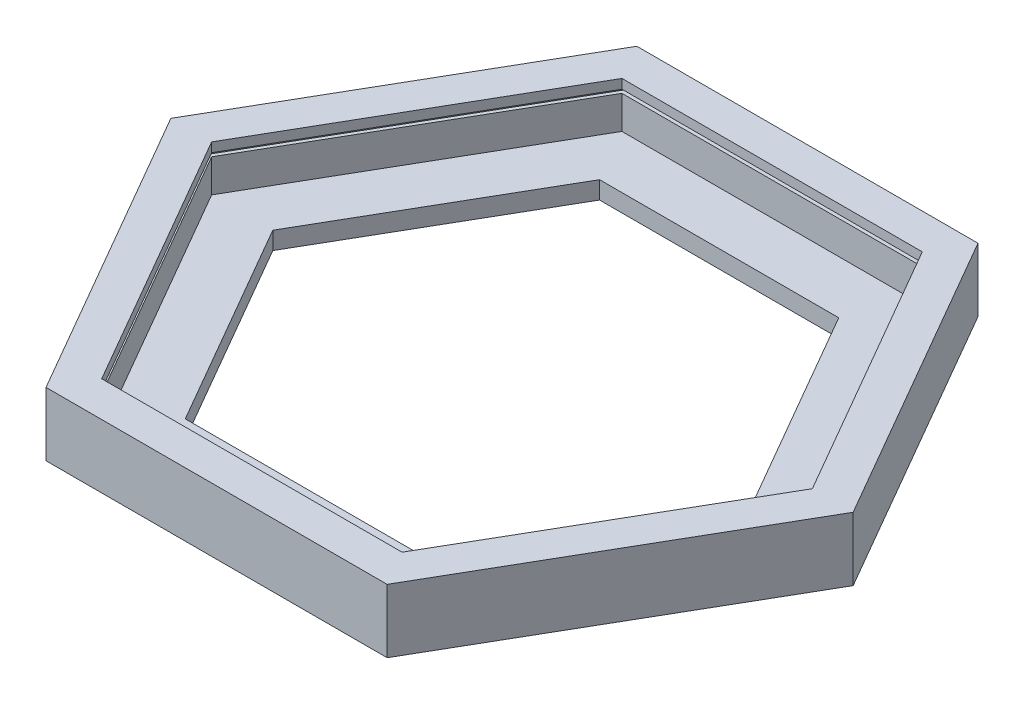
ISO-10303-21;
HEADER;
FILE_DESCRIPTION(('STEP AP214'),'2;1');
FILE_NAME('part.step','',(''),(''),'','','');
FILE_SCHEMA(('AUTOMOTIVE_DESIGN { 1 0 10303 214 1 1 1 1 }'));
ENDSEC;
DATA;
#1=APPLICATION_CONTEXT('core data for automotive mechanical design processes');
#2=APPLICATION_PROTOCOL_DEFINITION('international standard','automotive_design',2000,#1);
#3=PRODUCT_CONTEXT('',#1,'mechanical');
#4=PRODUCT('Part','Part','',(#3));
#5=PRODUCT_RELATED_PRODUCT_CATEGORY('part','',(#4));
#6=PRODUCT_DEFINITION_FORMATION('','',#4);
#7=PRODUCT_DEFINITION_CONTEXT('part definition',#1,'design');
#8=PRODUCT_DEFINITION('design','',#6,#7);
#9=PRODUCT_DEFINITION_SHAPE('','',#8);
#10=(LENGTH_UNIT() NAMED_UNIT(*) SI_UNIT(.MILLI.,.METRE.));
#11=(NAMED_UNIT(*) PLANE_ANGLE_UNIT() SI_UNIT($,.RADIAN.));
#12=(NAMED_UNIT(*) SI_UNIT($,.STERADIAN.) SOLID_ANGLE_UNIT());
#13=UNCERTAINTY_MEASURE_WITH_UNIT(LENGTH_MEASURE(1.E-05),#10,'distance_accuracy_value','');
#14=(GEOMETRIC_REPRESENTATION_CONTEXT(3) GLOBAL_UNCERTAINTY_ASSIGNED_CONTEXT((#13)) GLOBAL_UNIT_ASSIGNED_CONTEXT((#10,
#11,#12)) REPRESENTATION_CONTEXT('',''));
#15=CARTESIAN_POINT('',(0.,0.,0.));
#16=DIRECTION('',(0.,0.,1.));
#17=DIRECTION('',(1.,0.,0.));
#18=AXIS2_PLACEMENT_3D('',#15,#16,#17);
#19=CARTESIAN_POINT('',(-63.789419175,18.,36.8288383321362));
#20=DIRECTION('',(0.866025403784438,0.,-0.500000000000001));
#21=DIRECTION('',(-0.500000000000001,0.,-0.866025403784438));
#22=AXIS2_PLACEMENT_3D('',#19,#20,#21);
#23=PLANE('',#22);
#24=DIRECTION('',(0.,-1.,0.));
#25=VECTOR('',#24,1.);
#26=CARTESIAN_POINT('',(-85.0525589,18.,0.));
#27=LINE('',#26,#25);
#28=CARTESIAN_POINT('',(-85.0525589,14.35,0.));
#29=VERTEX_POINT('',#28);
#30=CARTESIAN_POINT('',(-85.0525589,5.,0.));
#31=VERTEX_POINT('',#30);
#32=EDGE_CURVE('E274',#29,#31,#27,.T.);
#33=ORIENTED_EDGE('',*,*,#32,.F.);
#34=DIRECTION('',(0.5,0.,0.866025403784439));
#35=VECTOR('',#34,1.);
#36=CARTESIAN_POINT('',(-85.0525589,14.35,0.));
#37=LINE('',#36,#35);
#38=CARTESIAN_POINT('',(-42.52627945,14.35,73.6576766642723));
#39=VERTEX_POINT('',#38);
#40=EDGE_CURVE('E481',#29,#39,#37,.T.);
#41=ORIENTED_EDGE('',*,*,#40,.T.);
#42=DIRECTION('',(0.,-1.,0.));
#43=VECTOR('',#42,1.);
#44=CARTESIAN_POINT('',(-42.5262794499999,18.,73.6576766642723));
#45=LINE('',#44,#43);
#46=CARTESIAN_POINT('',(-42.5262794499999,5.,73.6576766642723));
#47=VERTEX_POINT('',#46);
#48=EDGE_CURVE('E476',#39,#47,#45,.T.);
#49=ORIENTED_EDGE('',*,*,#48,.T.);
#50=DIRECTION('',(-0.500000000000001,0.,-0.866025403784438));
#51=VECTOR('',#50,1.);
#52=CARTESIAN_POINT('',(-63.789419175,5.,36.8288383321362));
#53=LINE('',#52,#51);
#54=EDGE_CURVE('E293',#47,#31,#53,.T.);
#55=ORIENTED_EDGE('',*,*,#54,.T.);
#56=EDGE_LOOP('',(#33,#41,#49,#55));
#57=FACE_BOUND('',#56,.T.);
#58=ADVANCED_FACE('F41',(#57),#23,.T.);
#59=CARTESIAN_POINT('',(-63.789419175,18.,-36.8288383321361));
#60=DIRECTION('',(0.866025403784439,0.,0.5));
#61=DIRECTION('',(0.5,0.,-0.866025403784439));
#62=AXIS2_PLACEMENT_3D('',#59,#60,#61);
#63=PLANE('',#62);
#64=DIRECTION('',(0.,-1.,0.));
#65=VECTOR('',#64,1.);
#66=CARTESIAN_POINT('',(-42.52627945,18.,-73.6576766642723));
#67=LINE('',#66,#65);
#68=CARTESIAN_POINT('',(-42.52627945,14.35,-73.6576766642723));
#69=VERTEX_POINT('',#68);
#70=CARTESIAN_POINT('',(-42.52627945,5.,-73.6576766642723));
#71=VERTEX_POINT('',#70);
#72=EDGE_CURVE('E270',#69,#71,#67,.T.);
#73=ORIENTED_EDGE('',*,*,#72,.F.);
#74=DIRECTION('',(-0.5,0.,0.866025403784439));
#75=VECTOR('',#74,1.);
#76=CARTESIAN_POINT('',(-42.52627945,14.35,-73.6576766642723));
#77=LINE('',#76,#75);
#78=EDGE_CURVE('E504',#69,#29,#77,.T.);
#79=ORIENTED_EDGE('',*,*,#78,.T.);
#80=ORIENTED_EDGE('',*,*,#32,.T.);
#81=DIRECTION('',(0.5,0.,-0.866025403784439));
#82=VECTOR('',#81,1.);
#83=CARTESIAN_POINT('',(-63.789419175,5.,-36.8288383321361));
#84=LINE('',#83,#82);
#85=EDGE_CURVE('E290',#31,#71,#84,.T.);
#86=ORIENTED_EDGE('',*,*,#85,.T.);
#87=EDGE_LOOP('',(#73,#79,#80,#86));
#88=FACE_BOUND('',#87,.T.);
#89=ADVANCED_FACE('F408',(#88),#63,.T.);
#90=CARTESIAN_POINT('',(0.,18.,-73.6576766642723));
#91=DIRECTION('',(0.,0.,1.));
#92=DIRECTION('',(1.,0.,0.));
#93=AXIS2_PLACEMENT_3D('',#90,#91,#92);
#94=PLANE('',#93);
#95=DIRECTION('',(0.,-1.,0.));
#96=VECTOR('',#95,1.);
#97=CARTESIAN_POINT('',(42.52627945,18.,-73.6576766642723));
#98=LINE('',#97,#96);
#99=CARTESIAN_POINT('',(42.52627945,14.35,-73.6576766642723));
#100=VERTEX_POINT('',#99);
#101=CARTESIAN_POINT('',(42.52627945,5.,-73.6576766642723));
#102=VERTEX_POINT('',#101);
#103=EDGE_CURVE('E262',#100,#102,#98,.T.);
#104=ORIENTED_EDGE('',*,*,#103,.F.);
#105=DIRECTION('',(-1.,0.,0.));
#106=VECTOR('',#105,1.);
#107=CARTESIAN_POINT('',(42.52627945,14.35,-73.6576766642723));
#108=LINE('',#107,#106);
#109=EDGE_CURVE('E501',#100,#69,#108,.T.);
#110=ORIENTED_EDGE('',*,*,#109,.T.);
#111=ORIENTED_EDGE('',*,*,#72,.T.);
#112=DIRECTION('',(1.,0.,0.));
#113=VECTOR('',#112,1.);
#114=CARTESIAN_POINT('',(0.,5.,-73.6576766642723));
#115=LINE('',#114,#113);
#116=EDGE_CURVE('E287',#71,#102,#115,.T.);
#117=ORIENTED_EDGE('',*,*,#116,.T.);
#118=EDGE_LOOP('',(#104,#110,#111,#117));
#119=FACE_BOUND('',#118,.T.);
#120=ADVANCED_FACE('F416',(#119),#94,.T.);
#121=CARTESIAN_POINT('',(63.789419175,18.,-36.8288383321362));
#122=DIRECTION('',(-0.866025403784438,0.,0.5));
#123=DIRECTION('',(0.5,0.,0.866025403784438));
#124=AXIS2_PLACEMENT_3D('',#121,#122,#123);
#125=PLANE('',#124);
#126=DIRECTION('',(0.,-1.,0.));
#127=VECTOR('',#126,1.);
#128=CARTESIAN_POINT('',(85.0525589,18.,0.));
#129=LINE('',#128,#127);
#130=CARTESIAN_POINT('',(85.0525589,14.35,0.));
#131=VERTEX_POINT('',#130);
#132=CARTESIAN_POINT('',(85.0525589,5.,0.));
#133=VERTEX_POINT('',#132);
#134=EDGE_CURVE('E263',#131,#133,#129,.T.);
#135=ORIENTED_EDGE('',*,*,#134,.F.);
#136=DIRECTION('',(-0.5,0.,-0.866025403784439));
#137=VECTOR('',#136,1.);
#138=CARTESIAN_POINT('',(85.0525589,14.35,0.));
#139=LINE('',#138,#137);
#140=EDGE_CURVE('E498',#131,#100,#139,.T.);
#141=ORIENTED_EDGE('',*,*,#140,.T.);
#142=ORIENTED_EDGE('',*,*,#103,.T.);
#143=DIRECTION('',(0.5,0.,0.866025403784438));
#144=VECTOR('',#143,1.);
#145=CARTESIAN_POINT('',(63.789419175,5.,-36.8288383321362));
#146=LINE('',#145,#144);
#147=EDGE_CURVE('E284',#102,#133,#146,.T.);
#148=ORIENTED_EDGE('',*,*,#147,.T.);
#149=EDGE_LOOP('',(#135,#141,#142,#148));
#150=FACE_BOUND('',#149,.T.);
#151=ADVANCED_FACE('F495',(#150),#125,.T.);
#152=CARTESIAN_POINT('',(63.789419175,18.,36.8288383321361));
#153=DIRECTION('',(-0.866025403784439,0.,-0.5));
#154=DIRECTION('',(-0.5,0.,0.866025403784439));
#155=AXIS2_PLACEMENT_3D('',#152,#153,#154);
#156=PLANE('',#155);
#157=DIRECTION('',(0.,-1.,0.));
#158=VECTOR('',#157,1.);
#159=CARTESIAN_POINT('',(42.52627945,18.,73.6576766642723));
#160=LINE('',#159,#158);
#161=CARTESIAN_POINT('',(42.52627945,14.35,73.6576766642723));
#162=VERTEX_POINT('',#161);
#163=CARTESIAN_POINT('',(42.52627945,5.,73.6576766642723));
#164=VERTEX_POINT('',#163);
#165=EDGE_CURVE('E477',#162,#164,#160,.T.);
#166=ORIENTED_EDGE('',*,*,#165,.F.);
#167=DIRECTION('',(0.5,0.,-0.866025403784439));
#168=VECTOR('',#167,1.);
#169=CARTESIAN_POINT('',(42.52627945,14.35,73.6576766642723));
#170=LINE('',#169,#168);
#171=EDGE_CURVE('E66',#162,#131,#170,.T.);
#172=ORIENTED_EDGE('',*,*,#171,.T.);
#173=ORIENTED_EDGE('',*,*,#134,.T.);
#174=DIRECTION('',(-0.5,0.,0.866025403784439));
#175=VECTOR('',#174,1.);
#176=CARTESIAN_POINT('',(63.789419175,5.,36.8288383321361));
#177=LINE('',#176,#175);
#178=EDGE_CURVE('E281',#133,#164,#177,.T.);
#179=ORIENTED_EDGE('',*,*,#178,.T.);
#180=EDGE_LOOP('',(#166,#172,#173,#179));
#181=FACE_BOUND('',#180,.T.);
#182=ADVANCED_FACE('F491',(#181),#156,.T.);
#183=CARTESIAN_POINT('',(0.,18.,73.6576766642723));
#184=DIRECTION('',(0.,0.,-1.));
#185=DIRECTION('',(-1.,0.,0.));
#186=AXIS2_PLACEMENT_3D('',#183,#184,#185);
#187=PLANE('',#186);
#188=ORIENTED_EDGE('',*,*,#48,.F.);
#189=DIRECTION('',(1.,0.,0.));
#190=VECTOR('',#189,1.);
#191=CARTESIAN_POINT('',(-42.52627945,14.35,73.6576766642723));
#192=LINE('',#191,#190);
#193=EDGE_CURVE('E247',#39,#162,#192,.T.);
#194=ORIENTED_EDGE('',*,*,#193,.T.);
#195=ORIENTED_EDGE('',*,*,#165,.T.);
#196=DIRECTION('',(-1.,0.,0.));
#197=VECTOR('',#196,1.);
#198=CARTESIAN_POINT('',(0.,5.,73.6576766642723));
#199=LINE('',#198,#197);
#200=EDGE_CURVE('E278',#164,#47,#199,.T.);
#201=ORIENTED_EDGE('',*,*,#200,.T.);
#202=EDGE_LOOP('',(#188,#194,#195,#201));
#203=FACE_BOUND('',#202,.T.);
#204=ADVANCED_FACE('F488',(#203),#187,.T.);
#205=CARTESIAN_POINT('',(-72.4496732128444,5.,-41.8288383321362));
#206=DIRECTION('',(0.866025403784439,0.,0.5));
#207=DIRECTION('',(0.5,0.,-0.866025403784439));
#208=AXIS2_PLACEMENT_3D('',#205,#206,#207);
#209=PLANE('',#208);
#210=DIRECTION('',(-0.5,0.,0.866025403784439));
#211=VECTOR('',#210,1.);
#212=CARTESIAN_POINT('',(-72.4496732128444,0.,-41.8288383321362));
#213=LINE('',#212,#211);
#214=CARTESIAN_POINT('',(-48.2997821418963,0.,-83.6576766642723));
#215=VERTEX_POINT('',#214);
#216=CARTESIAN_POINT('',(-96.5995642837926,0.,0.));
#217=VERTEX_POINT('',#216);
#218=EDGE_CURVE('E334',#215,#217,#213,.T.);
#219=ORIENTED_EDGE('',*,*,#218,.T.);
#220=DIRECTION('',(0.,-1.,0.));
#221=VECTOR('',#220,1.);
#222=CARTESIAN_POINT('',(-96.5995642837926,5.,0.));
#223=LINE('',#222,#221);
#224=CARTESIAN_POINT('',(-96.5995642837926,18.,0.));
#225=VERTEX_POINT('',#224);
#226=EDGE_CURVE('E11',#225,#217,#223,.T.);
#227=ORIENTED_EDGE('',*,*,#226,.F.);
#228=DIRECTION('',(-0.5,0.,0.866025403784439));
#229=VECTOR('',#228,1.);
#230=CARTESIAN_POINT('',(-72.4496732128444,18.,-41.8288383321362));
#231=LINE('',#230,#229);
#232=CARTESIAN_POINT('',(-48.2997821418963,18.,-83.6576766642723));
#233=VERTEX_POINT('',#232);
#234=EDGE_CURVE('E459',#233,#225,#231,.T.);
#235=ORIENTED_EDGE('',*,*,#234,.F.);
#236=DIRECTION('',(0.,-1.,0.));
#237=VECTOR('',#236,1.);
#238=CARTESIAN_POINT('',(-48.2997821418963,5.,-83.6576766642723));
#239=LINE('',#238,#237);
#240=EDGE_CURVE('E346',#233,#215,#239,.T.);
#241=ORIENTED_EDGE('',*,*,#240,.T.);
#242=EDGE_LOOP('',(#219,#227,#235,#241));
#243=FACE_BOUND('',#242,.T.);
#244=ADVANCED_FACE('F622',(#243),#209,.F.);
#245=CARTESIAN_POINT('',(-72.4496732128444,5.,41.8288383321361));
#246=DIRECTION('',(0.866025403784439,0.,-0.5));
#247=DIRECTION('',(-0.5,0.,-0.866025403784439));
#248=AXIS2_PLACEMENT_3D('',#245,#246,#247);
#249=PLANE('',#248);
#250=DIRECTION('',(0.5,0.,0.866025403784439));
#251=VECTOR('',#250,1.);
#252=CARTESIAN_POINT('',(-72.4496732128444,0.,41.8288383321361));
#253=LINE('',#252,#251);
#254=CARTESIAN_POINT('',(-48.2997821418963,0.,83.6576766642723));
#255=VERTEX_POINT('',#254);
#256=EDGE_CURVE('E337',#217,#255,#253,.T.);
#257=ORIENTED_EDGE('',*,*,#256,.T.);
#258=DIRECTION('',(0.,-1.,0.));
#259=VECTOR('',#258,1.);
#260=CARTESIAN_POINT('',(-48.2997821418963,5.,83.6576766642723));
#261=LINE('',#260,#259);
#262=CARTESIAN_POINT('',(-48.2997821418963,18.,83.6576766642723));
#263=VERTEX_POINT('',#262);
#264=EDGE_CURVE('E50',#263,#255,#261,.T.);
#265=ORIENTED_EDGE('',*,*,#264,.F.);
#266=DIRECTION('',(0.5,0.,0.866025403784439));
#267=VECTOR('',#266,1.);
#268=CARTESIAN_POINT('',(-72.4496732128444,18.,41.8288383321361));
#269=LINE('',#268,#267);
#270=EDGE_CURVE('E462',#225,#263,#269,.T.);
#271=ORIENTED_EDGE('',*,*,#270,.F.);
#272=ORIENTED_EDGE('',*,*,#226,.T.);
#273=EDGE_LOOP('',(#257,#265,#271,#272));
#274=FACE_BOUND('',#273,.T.);
#275=ADVANCED_FACE('F625',(#274),#249,.F.);
#276=CARTESIAN_POINT('',(0.,5.,83.6576766642723));
#277=DIRECTION('',(0.,0.,-1.));
#278=DIRECTION('',(-1.,0.,0.));
#279=AXIS2_PLACEMENT_3D('',#276,#277,#278);
#280=PLANE('',#279);
#281=DIRECTION('',(1.,0.,0.));
#282=VECTOR('',#281,1.);
#283=CARTESIAN_POINT('',(0.,0.,83.6576766642723));
#284=LINE('',#283,#282);
#285=CARTESIAN_POINT('',(48.2997821418963,0.,83.6576766642723));
#286=VERTEX_POINT('',#285);
#287=EDGE_CURVE('E339',#255,#286,#284,.T.);
#288=ORIENTED_EDGE('',*,*,#287,.T.);
#289=DIRECTION('',(0.,-1.,0.));
#290=VECTOR('',#289,1.);
#291=CARTESIAN_POINT('',(48.2997821418963,5.,83.6576766642723));
#292=LINE('',#291,#290);
#293=CARTESIAN_POINT('',(48.2997821418963,18.,83.6576766642723));
#294=VERTEX_POINT('',#293);
#295=EDGE_CURVE('E355',#294,#286,#292,.T.);
#296=ORIENTED_EDGE('',*,*,#295,.F.);
#297=DIRECTION('',(1.,0.,0.));
#298=VECTOR('',#297,1.);
#299=CARTESIAN_POINT('',(0.,18.,83.6576766642723));
#300=LINE('',#299,#298);
#301=EDGE_CURVE('E465',#263,#294,#300,.T.);
#302=ORIENTED_EDGE('',*,*,#301,.F.);
#303=ORIENTED_EDGE('',*,*,#264,.T.);
#304=EDGE_LOOP('',(#288,#296,#302,#303));
#305=FACE_BOUND('',#304,.T.);
#306=ADVANCED_FACE('F630',(#305),#280,.F.);
#307=CARTESIAN_POINT('',(72.4496732128444,5.,41.8288383321361));
#308=DIRECTION('',(-0.866025403784439,0.,-0.5));
#309=DIRECTION('',(-0.5,0.,0.866025403784439));
#310=AXIS2_PLACEMENT_3D('',#307,#308,#309);
#311=PLANE('',#310);
#312=DIRECTION('',(0.5,0.,-0.866025403784439));
#313=VECTOR('',#312,1.);
#314=CARTESIAN_POINT('',(72.4496732128444,0.,41.8288383321361));
#315=LINE('',#314,#313);
#316=CARTESIAN_POINT('',(96.5995642837926,0.,0.));
#317=VERTEX_POINT('',#316);
#318=EDGE_CURVE('E341',#286,#317,#315,.T.);
#319=ORIENTED_EDGE('',*,*,#318,.T.);
#320=DIRECTION('',(0.,-1.,0.));
#321=VECTOR('',#320,1.);
#322=CARTESIAN_POINT('',(96.5995642837926,5.,0.));
#323=LINE('',#322,#321);
#324=CARTESIAN_POINT('',(96.5995642837926,18.,0.));
#325=VERTEX_POINT('',#324);
#326=EDGE_CURVE('E352',#325,#317,#323,.T.);
#327=ORIENTED_EDGE('',*,*,#326,.F.);
#328=DIRECTION('',(0.5,0.,-0.866025403784439));
#329=VECTOR('',#328,1.);
#330=CARTESIAN_POINT('',(72.4496732128444,18.,41.8288383321361));
#331=LINE('',#330,#329);
#332=EDGE_CURVE('E468',#294,#325,#331,.T.);
#333=ORIENTED_EDGE('',*,*,#332,.F.);
#334=ORIENTED_EDGE('',*,*,#295,.T.);
#335=EDGE_LOOP('',(#319,#327,#333,#334));
#336=FACE_BOUND('',#335,.T.);
#337=ADVANCED_FACE('F636',(#336),#311,.F.);
#338=CARTESIAN_POINT('',(72.4496732128444,5.,-41.8288383321361));
#339=DIRECTION('',(-0.866025403784439,0.,0.5));
#340=DIRECTION('',(0.5,0.,0.866025403784439));
#341=AXIS2_PLACEMENT_3D('',#338,#339,#340);
#342=PLANE('',#341);
#343=DIRECTION('',(-0.5,0.,-0.866025403784439));
#344=VECTOR('',#343,1.);
#345=CARTESIAN_POINT('',(72.4496732128444,0.,-41.8288383321361));
#346=LINE('',#345,#344);
#347=CARTESIAN_POINT('',(48.2997821418963,0.,-83.6576766642723));
#348=VERTEX_POINT('',#347);
#349=EDGE_CURVE('E343',#317,#348,#346,.T.);
#350=ORIENTED_EDGE('',*,*,#349,.T.);
#351=DIRECTION('',(0.,-1.,0.));
#352=VECTOR('',#351,1.);
#353=CARTESIAN_POINT('',(48.2997821418963,5.,-83.6576766642723));
#354=LINE('',#353,#352);
#355=CARTESIAN_POINT('',(48.2997821418963,18.,-83.6576766642723));
#356=VERTEX_POINT('',#355);
#357=EDGE_CURVE('E349',#356,#348,#354,.T.);
#358=ORIENTED_EDGE('',*,*,#357,.F.);
#359=DIRECTION('',(-0.5,0.,-0.866025403784439));
#360=VECTOR('',#359,1.);
#361=CARTESIAN_POINT('',(72.4496732128444,18.,-41.8288383321361));
#362=LINE('',#361,#360);
#363=EDGE_CURVE('E471',#325,#356,#362,.T.);
#364=ORIENTED_EDGE('',*,*,#363,.F.);
#365=ORIENTED_EDGE('',*,*,#326,.T.);
#366=EDGE_LOOP('',(#350,#358,#364,#365));
#367=FACE_BOUND('',#366,.T.);
#368=ADVANCED_FACE('F640',(#367),#342,.F.);
#369=CARTESIAN_POINT('',(50.7990381182334,5.,-29.3288383321362));
#370=DIRECTION('',(-0.866025403784438,0.,0.5));
#371=DIRECTION('',(0.5,0.,0.866025403784438));
#372=AXIS2_PLACEMENT_3D('',#369,#370,#371);
#373=PLANE('',#372);
#374=DIRECTION('',(-0.5,0.,-0.866025403784439));
#375=VECTOR('',#374,1.);
#376=CARTESIAN_POINT('',(50.7990381182334,0.,-29.3288383321362));
#377=LINE('',#376,#375);
#378=CARTESIAN_POINT('',(67.7320508243113,0.,0.));
#379=VERTEX_POINT('',#378);
#380=CARTESIAN_POINT('',(33.8660254121556,0.,-58.6576766642723));
#381=VERTEX_POINT('',#380);
#382=EDGE_CURVE('E296',#379,#381,#377,.T.);
#383=ORIENTED_EDGE('',*,*,#382,.F.);
#384=DIRECTION('',(0.,-1.,0.));
#385=VECTOR('',#384,1.);
#386=CARTESIAN_POINT('',(67.7320508243113,5.,0.));
#387=LINE('',#386,#385);
#388=CARTESIAN_POINT('',(67.7320508243113,5.,0.));
#389=VERTEX_POINT('',#388);
#390=EDGE_CURVE('E45',#389,#379,#387,.T.);
#391=ORIENTED_EDGE('',*,*,#390,.F.);
#392=DIRECTION('',(-0.5,0.,-0.866025403784439));
#393=VECTOR('',#392,1.);
#394=CARTESIAN_POINT('',(50.7990381182334,5.,-29.3288383321362));
#395=LINE('',#394,#393);
#396=CARTESIAN_POINT('',(33.8660254121556,5.,-58.6576766642723));
#397=VERTEX_POINT('',#396);
#398=EDGE_CURVE('E297',#389,#397,#395,.T.);
#399=ORIENTED_EDGE('',*,*,#398,.T.);
#400=DIRECTION('',(0.,-1.,0.));
#401=VECTOR('',#400,1.);
#402=CARTESIAN_POINT('',(33.8660254121556,5.,-58.6576766642723));
#403=LINE('',#402,#401);
#404=EDGE_CURVE('E316',#397,#381,#403,.T.);
#405=ORIENTED_EDGE('',*,*,#404,.T.);
#406=EDGE_LOOP('',(#383,#391,#399,#405));
#407=FACE_BOUND('',#406,.T.);
#408=ADVANCED_FACE('F43',(#407),#373,.T.);
#409=CARTESIAN_POINT('',(50.7990381182334,5.,29.3288383321361));
#410=DIRECTION('',(-0.866025403784439,0.,-0.5));
#411=DIRECTION('',(-0.5,0.,0.866025403784439));
#412=AXIS2_PLACEMENT_3D('',#409,#410,#411);
#413=PLANE('',#412);
#414=DIRECTION('',(0.5,0.,-0.866025403784439));
#415=VECTOR('',#414,1.);
#416=CARTESIAN_POINT('',(50.7990381182334,0.,29.3288383321361));
#417=LINE('',#416,#415);
#418=CARTESIAN_POINT('',(33.8660254121556,0.,58.6576766642723));
#419=VERTEX_POINT('',#418);
#420=EDGE_CURVE('E319',#419,#379,#417,.T.);
#421=ORIENTED_EDGE('',*,*,#420,.F.);
#422=DIRECTION('',(0.,-1.,0.));
#423=VECTOR('',#422,1.);
#424=CARTESIAN_POINT('',(33.8660254121556,5.,58.6576766642723));
#425=LINE('',#424,#423);
#426=CARTESIAN_POINT('',(33.8660254121556,5.,58.6576766642723));
#427=VERTEX_POINT('',#426);
#428=EDGE_CURVE('E366',#427,#419,#425,.T.);
#429=ORIENTED_EDGE('',*,*,#428,.F.);
#430=DIRECTION('',(0.5,0.,-0.866025403784439));
#431=VECTOR('',#430,1.);
#432=CARTESIAN_POINT('',(50.7990381182334,5.,29.3288383321361));
#433=LINE('',#432,#431);
#434=EDGE_CURVE('E300',#427,#389,#433,.T.);
#435=ORIENTED_EDGE('',*,*,#434,.T.);
#436=ORIENTED_EDGE('',*,*,#390,.T.);
#437=EDGE_LOOP('',(#421,#429,#435,#436));
#438=FACE_BOUND('',#437,.T.);
#439=ADVANCED_FACE('F372',(#438),#413,.T.);
#440=CARTESIAN_POINT('',(0.,5.,58.6576766642723));
#441=DIRECTION('',(0.,0.,-1.));
#442=DIRECTION('',(-1.,0.,0.));
#443=AXIS2_PLACEMENT_3D('',#440,#441,#442);
#444=PLANE('',#443);
#445=DIRECTION('',(1.,0.,0.));
#446=VECTOR('',#445,1.);
#447=CARTESIAN_POINT('',(0.,0.,58.6576766642723));
#448=LINE('',#447,#446);
#449=CARTESIAN_POINT('',(-33.8660254121556,0.,58.6576766642723));
#450=VERTEX_POINT('',#449);
#451=EDGE_CURVE('E322',#450,#419,#448,.T.);
#452=ORIENTED_EDGE('',*,*,#451,.F.);
#453=DIRECTION('',(0.,-1.,0.));
#454=VECTOR('',#453,1.);
#455=CARTESIAN_POINT('',(-33.8660254121556,5.,58.6576766642723));
#456=LINE('',#455,#454);
#457=CARTESIAN_POINT('',(-33.8660254121556,5.,58.6576766642723));
#458=VERTEX_POINT('',#457);
#459=EDGE_CURVE('E365',#458,#450,#456,.T.);
#460=ORIENTED_EDGE('',*,*,#459,.F.);
#461=DIRECTION('',(1.,0.,0.));
#462=VECTOR('',#461,1.);
#463=CARTESIAN_POINT('',(0.,5.,58.6576766642723));
#464=LINE('',#463,#462);
#465=EDGE_CURVE('E304',#458,#427,#464,.T.);
#466=ORIENTED_EDGE('',*,*,#465,.T.);
#467=ORIENTED_EDGE('',*,*,#428,.T.);
#468=EDGE_LOOP('',(#452,#460,#466,#467));
#469=FACE_BOUND('',#468,.T.);
#470=ADVANCED_FACE('F381',(#469),#444,.T.);
#471=CARTESIAN_POINT('',(-50.7990381182334,5.,29.3288383321362));
#472=DIRECTION('',(0.866025403784439,0.,-0.5));
#473=DIRECTION('',(-0.5,0.,-0.866025403784439));
#474=AXIS2_PLACEMENT_3D('',#471,#472,#473);
#475=PLANE('',#474);
#476=DIRECTION('',(0.5,0.,0.866025403784439));
#477=VECTOR('',#476,1.);
#478=CARTESIAN_POINT('',(-50.7990381182334,0.,29.3288383321362));
#479=LINE('',#478,#477);
#480=CARTESIAN_POINT('',(-67.7320508243113,0.,0.));
#481=VERTEX_POINT('',#480);
#482=EDGE_CURVE('E325',#481,#450,#479,.T.);
#483=ORIENTED_EDGE('',*,*,#482,.F.);
#484=DIRECTION('',(0.,-1.,0.));
#485=VECTOR('',#484,1.);
#486=CARTESIAN_POINT('',(-67.7320508243113,5.,0.));
#487=LINE('',#486,#485);
#488=CARTESIAN_POINT('',(-67.7320508243113,5.,0.));
#489=VERTEX_POINT('',#488);
#490=EDGE_CURVE('E363',#489,#481,#487,.T.);
#491=ORIENTED_EDGE('',*,*,#490,.F.);
#492=DIRECTION('',(0.5,0.,0.866025403784439));
#493=VECTOR('',#492,1.);
#494=CARTESIAN_POINT('',(-50.7990381182334,5.,29.3288383321362));
#495=LINE('',#494,#493);
#496=EDGE_CURVE('E307',#489,#458,#495,.T.);
#497=ORIENTED_EDGE('',*,*,#496,.T.);
#498=ORIENTED_EDGE('',*,*,#459,.T.);
#499=EDGE_LOOP('',(#483,#491,#497,#498));
#500=FACE_BOUND('',#499,.T.);
#501=ADVANCED_FACE('F388',(#500),#475,.T.);
#502=CARTESIAN_POINT('',(-50.7990381182334,5.,-29.3288383321361));
#503=DIRECTION('',(0.866025403784439,0.,0.5));
#504=DIRECTION('',(0.5,0.,-0.866025403784439));
#505=AXIS2_PLACEMENT_3D('',#502,#503,#504);
#506=PLANE('',#505);
#507=DIRECTION('',(-0.5,0.,0.866025403784439));
#508=VECTOR('',#507,1.);
#509=CARTESIAN_POINT('',(-50.7990381182334,0.,-29.3288383321361));
#510=LINE('',#509,#508);
#511=CARTESIAN_POINT('',(-33.8660254121556,0.,-58.6576766642723));
#512=VERTEX_POINT('',#511);
#513=EDGE_CURVE('E328',#512,#481,#510,.T.);
#514=ORIENTED_EDGE('',*,*,#513,.F.);
#515=DIRECTION('',(0.,-1.,0.));
#516=VECTOR('',#515,1.);
#517=CARTESIAN_POINT('',(-33.8660254121556,5.,-58.6576766642723));
#518=LINE('',#517,#516);
#519=CARTESIAN_POINT('',(-33.8660254121556,5.,-58.6576766642723));
#520=VERTEX_POINT('',#519);
#521=EDGE_CURVE('E361',#520,#512,#518,.T.);
#522=ORIENTED_EDGE('',*,*,#521,.F.);
#523=DIRECTION('',(-0.5,0.,0.866025403784439));
#524=VECTOR('',#523,1.);
#525=CARTESIAN_POINT('',(-50.7990381182334,5.,-29.3288383321361));
#526=LINE('',#525,#524);
#527=EDGE_CURVE('E310',#520,#489,#526,.T.);
#528=ORIENTED_EDGE('',*,*,#527,.T.);
#529=ORIENTED_EDGE('',*,*,#490,.T.);
#530=EDGE_LOOP('',(#514,#522,#528,#529));
#531=FACE_BOUND('',#530,.T.);
#532=ADVANCED_FACE('F391',(#531),#506,.T.);
#533=CARTESIAN_POINT('',(0.,5.,-58.6576766642723));
#534=DIRECTION('',(0.,0.,1.));
#535=DIRECTION('',(1.,0.,0.));
#536=AXIS2_PLACEMENT_3D('',#533,#534,#535);
#537=PLANE('',#536);
#538=DIRECTION('',(-1.,0.,0.));
#539=VECTOR('',#538,1.);
#540=CARTESIAN_POINT('',(0.,0.,-58.6576766642723));
#541=LINE('',#540,#539);
#542=EDGE_CURVE('E331',#381,#512,#541,.T.);
#543=ORIENTED_EDGE('',*,*,#542,.F.);
#544=ORIENTED_EDGE('',*,*,#404,.F.);
#545=DIRECTION('',(-1.,0.,0.));
#546=VECTOR('',#545,1.);
#547=CARTESIAN_POINT('',(0.,5.,-58.6576766642723));
#548=LINE('',#547,#546);
#549=EDGE_CURVE('E313',#397,#520,#548,.T.);
#550=ORIENTED_EDGE('',*,*,#549,.T.);
#551=ORIENTED_EDGE('',*,*,#521,.T.);
#552=EDGE_LOOP('',(#543,#544,#550,#551));
#553=FACE_BOUND('',#552,.T.);
#554=ADVANCED_FACE('F394',(#553),#537,.T.);
#555=CARTESIAN_POINT('',(0.,5.,-83.6576766642723));
#556=DIRECTION('',(0.,0.,1.));
#557=DIRECTION('',(1.,0.,0.));
#558=AXIS2_PLACEMENT_3D('',#555,#556,#557);
#559=PLANE('',#558);
#560=DIRECTION('',(-1.,0.,0.));
#561=VECTOR('',#560,1.);
#562=CARTESIAN_POINT('',(0.,0.,-83.6576766642723));
#563=LINE('',#562,#561);
#564=EDGE_CURVE('E301',#348,#215,#563,.T.);
#565=ORIENTED_EDGE('',*,*,#564,.T.);
#566=ORIENTED_EDGE('',*,*,#240,.F.);
#567=DIRECTION('',(-1.,0.,0.));
#568=VECTOR('',#567,1.);
#569=CARTESIAN_POINT('',(0.,18.,-83.6576766642723));
#570=LINE('',#569,#568);
#571=EDGE_CURVE('E474',#356,#233,#570,.T.);
#572=ORIENTED_EDGE('',*,*,#571,.F.);
#573=ORIENTED_EDGE('',*,*,#357,.T.);
#574=EDGE_LOOP('',(#565,#566,#572,#573));
#575=FACE_BOUND('',#574,.T.);
#576=ADVANCED_FACE('F396',(#575),#559,.F.);
#577=CARTESIAN_POINT('',(0.,5.,0.));
#578=DIRECTION('',(0.,1.,0.));
#579=DIRECTION('',(0.,0.,1.));
#580=AXIS2_PLACEMENT_3D('',#577,#578,#579);
#581=PLANE('',#580);
#582=ORIENTED_EDGE('',*,*,#54,.F.);
#583=ORIENTED_EDGE('',*,*,#200,.F.);
#584=ORIENTED_EDGE('',*,*,#178,.F.);
#585=ORIENTED_EDGE('',*,*,#147,.F.);
#586=ORIENTED_EDGE('',*,*,#116,.F.);
#587=ORIENTED_EDGE('',*,*,#85,.F.);
#588=EDGE_LOOP('',(#582,#583,#584,#585,#586,#587));
#589=FACE_BOUND('',#588,.T.);
#590=ORIENTED_EDGE('',*,*,#398,.F.);
#591=ORIENTED_EDGE('',*,*,#434,.F.);
#592=ORIENTED_EDGE('',*,*,#465,.F.);
#593=ORIENTED_EDGE('',*,*,#496,.F.);
#594=ORIENTED_EDGE('',*,*,#527,.F.);
#595=ORIENTED_EDGE('',*,*,#549,.F.);
#596=EDGE_LOOP('',(#590,#591,#592,#593,#594,#595));
#597=FACE_BOUND('',#596,.T.);
#598=ADVANCED_FACE('F386',(#589,#597),#581,.T.);
#599=CARTESIAN_POINT('',(0.,0.,0.));
#600=DIRECTION('',(0.,1.,0.));
#601=DIRECTION('',(0.,0.,1.));
#602=AXIS2_PLACEMENT_3D('',#599,#600,#601);
#603=PLANE('',#602);
#604=ORIENTED_EDGE('',*,*,#382,.T.);
#605=ORIENTED_EDGE('',*,*,#542,.T.);
#606=ORIENTED_EDGE('',*,*,#513,.T.);
#607=ORIENTED_EDGE('',*,*,#482,.T.);
#608=ORIENTED_EDGE('',*,*,#451,.T.);
#609=ORIENTED_EDGE('',*,*,#420,.T.);
#610=EDGE_LOOP('',(#604,#605,#606,#607,#608,#609));
#611=FACE_BOUND('',#610,.T.);
#612=ORIENTED_EDGE('',*,*,#218,.F.);
#613=ORIENTED_EDGE('',*,*,#564,.F.);
#614=ORIENTED_EDGE('',*,*,#349,.F.);
#615=ORIENTED_EDGE('',*,*,#318,.F.);
#616=ORIENTED_EDGE('',*,*,#287,.F.);
#617=ORIENTED_EDGE('',*,*,#256,.F.);
#618=EDGE_LOOP('',(#612,#613,#614,#615,#616,#617));
#619=FACE_BOUND('',#618,.T.);
#620=ADVANCED_FACE('F378',(#611,#619),#603,.F.);
#621=DIRECTION('',(0.5,0.,0.866025403784439));
#622=VECTOR('',#621,1.);
#623=CARTESIAN_POINT('',(-85.0525589,15.35,0.));
#624=LINE('',#623,#622);
#625=CARTESIAN_POINT('',(-85.0525589,15.35,0.));
#626=VERTEX_POINT('',#625);
#627=CARTESIAN_POINT('',(-42.5262794499999,15.35,73.6576766642723));
#628=VERTEX_POINT('',#627);
#629=EDGE_CURVE('E58',#626,#628,#624,.T.);
#630=ORIENTED_EDGE('',*,*,#629,.F.);
#631=CARTESIAN_POINT('',(-85.0525589,18.,0.));
#632=VERTEX_POINT('',#631);
#633=EDGE_CURVE('E275',#632,#626,#27,.T.);
#634=ORIENTED_EDGE('',*,*,#633,.F.);
#635=DIRECTION('',(0.500000000000001,0.,0.866025403784438));
#636=VECTOR('',#635,1.);
#637=CARTESIAN_POINT('',(-63.789419175,18.,36.8288383321362));
#638=LINE('',#637,#636);
#639=CARTESIAN_POINT('',(-42.5262794499999,18.,73.6576766642723));
#640=VERTEX_POINT('',#639);
#641=EDGE_CURVE('E446',#632,#640,#638,.T.);
#642=ORIENTED_EDGE('',*,*,#641,.T.);
#643=EDGE_CURVE('E435',#640,#628,#45,.T.);
#644=ORIENTED_EDGE('',*,*,#643,.T.);
#645=EDGE_LOOP('',(#630,#634,#642,#644));
#646=FACE_BOUND('',#645,.T.);
#647=ADVANCED_FACE('F411',(#646),#23,.T.);
#648=DIRECTION('',(-0.5,0.,0.866025403784439));
#649=VECTOR('',#648,1.);
#650=CARTESIAN_POINT('',(-42.52627945,15.35,-73.6576766642723));
#651=LINE('',#650,#649);
#652=CARTESIAN_POINT('',(-42.52627945,15.35,-73.6576766642723));
#653=VERTEX_POINT('',#652);
#654=EDGE_CURVE('E436',#653,#626,#651,.T.);
#655=ORIENTED_EDGE('',*,*,#654,.F.);
#656=CARTESIAN_POINT('',(-42.52627945,18.,-73.6576766642723));
#657=VERTEX_POINT('',#656);
#658=EDGE_CURVE('E271',#657,#653,#67,.T.);
#659=ORIENTED_EDGE('',*,*,#658,.F.);
#660=DIRECTION('',(-0.5,0.,0.866025403784439));
#661=VECTOR('',#660,1.);
#662=CARTESIAN_POINT('',(-63.789419175,18.,-36.8288383321361));
#663=LINE('',#662,#661);
#664=EDGE_CURVE('E441',#657,#632,#663,.T.);
#665=ORIENTED_EDGE('',*,*,#664,.T.);
#666=ORIENTED_EDGE('',*,*,#633,.T.);
#667=EDGE_LOOP('',(#655,#659,#665,#666));
#668=FACE_BOUND('',#667,.T.);
#669=ADVANCED_FACE('F419',(#668),#63,.T.);
#670=DIRECTION('',(-1.,0.,0.));
#671=VECTOR('',#670,1.);
#672=CARTESIAN_POINT('',(42.52627945,15.35,-73.6576766642723));
#673=LINE('',#672,#671);
#674=CARTESIAN_POINT('',(42.52627945,15.35,-73.6576766642723));
#675=VERTEX_POINT('',#674);
#676=EDGE_CURVE('E256',#675,#653,#673,.T.);
#677=ORIENTED_EDGE('',*,*,#676,.F.);
#678=CARTESIAN_POINT('',(42.52627945,18.,-73.6576766642723));
#679=VERTEX_POINT('',#678);
#680=EDGE_CURVE('E255',#679,#675,#98,.T.);
#681=ORIENTED_EDGE('',*,*,#680,.F.);
#682=DIRECTION('',(-1.,0.,0.));
#683=VECTOR('',#682,1.);
#684=CARTESIAN_POINT('',(0.,18.,-73.6576766642723));
#685=LINE('',#684,#683);
#686=EDGE_CURVE('E445',#679,#657,#685,.T.);
#687=ORIENTED_EDGE('',*,*,#686,.T.);
#688=ORIENTED_EDGE('',*,*,#658,.T.);
#689=EDGE_LOOP('',(#677,#681,#687,#688));
#690=FACE_BOUND('',#689,.T.);
#691=ADVANCED_FACE('F428',(#690),#94,.T.);
#692=DIRECTION('',(-0.5,0.,-0.866025403784439));
#693=VECTOR('',#692,1.);
#694=CARTESIAN_POINT('',(85.0525589,15.35,0.));
#695=LINE('',#694,#693);
#696=CARTESIAN_POINT('',(85.0525589,15.35,0.));
#697=VERTEX_POINT('',#696);
#698=EDGE_CURVE('E241',#697,#675,#695,.T.);
#699=ORIENTED_EDGE('',*,*,#698,.F.);
#700=CARTESIAN_POINT('',(85.0525589,18.,0.));
#701=VERTEX_POINT('',#700);
#702=EDGE_CURVE('E253',#701,#697,#129,.T.);
#703=ORIENTED_EDGE('',*,*,#702,.F.);
#704=DIRECTION('',(-0.5,0.,-0.866025403784438));
#705=VECTOR('',#704,1.);
#706=CARTESIAN_POINT('',(63.789419175,18.,-36.8288383321362));
#707=LINE('',#706,#705);
#708=EDGE_CURVE('E448',#701,#679,#707,.T.);
#709=ORIENTED_EDGE('',*,*,#708,.T.);
#710=ORIENTED_EDGE('',*,*,#680,.T.);
#711=EDGE_LOOP('',(#699,#703,#709,#710));
#712=FACE_BOUND('',#711,.T.);
#713=ADVANCED_FACE('F251',(#712),#125,.T.);
#714=DIRECTION('',(0.5,0.,-0.866025403784439));
#715=VECTOR('',#714,1.);
#716=CARTESIAN_POINT('',(42.52627945,15.35,73.6576766642723));
#717=LINE('',#716,#715);
#718=CARTESIAN_POINT('',(42.52627945,15.35,73.6576766642723));
#719=VERTEX_POINT('',#718);
#720=EDGE_CURVE('E238',#719,#697,#717,.T.);
#721=ORIENTED_EDGE('',*,*,#720,.F.);
#722=CARTESIAN_POINT('',(42.52627945,18.,73.6576766642723));
#723=VERTEX_POINT('',#722);
#724=EDGE_CURVE('E266',#723,#719,#160,.T.);
#725=ORIENTED_EDGE('',*,*,#724,.F.);
#726=DIRECTION('',(0.5,0.,-0.866025403784439));
#727=VECTOR('',#726,1.);
#728=CARTESIAN_POINT('',(63.789419175,18.,36.8288383321361));
#729=LINE('',#728,#727);
#730=EDGE_CURVE('E261',#723,#701,#729,.T.);
#731=ORIENTED_EDGE('',*,*,#730,.T.);
#732=ORIENTED_EDGE('',*,*,#702,.T.);
#733=EDGE_LOOP('',(#721,#725,#731,#732));
#734=FACE_BOUND('',#733,.T.);
#735=ADVANCED_FACE('F259',(#734),#156,.T.);
#736=DIRECTION('',(1.,0.,0.));
#737=VECTOR('',#736,1.);
#738=CARTESIAN_POINT('',(-42.52627945,15.35,73.6576766642723));
#739=LINE('',#738,#737);
#740=EDGE_CURVE('E243',#628,#719,#739,.T.);
#741=ORIENTED_EDGE('',*,*,#740,.F.);
#742=ORIENTED_EDGE('',*,*,#643,.F.);
#743=DIRECTION('',(1.,0.,0.));
#744=VECTOR('',#743,1.);
#745=CARTESIAN_POINT('',(0.,18.,73.6576766642723));
#746=LINE('',#745,#744);
#747=EDGE_CURVE('E456',#640,#723,#746,.T.);
#748=ORIENTED_EDGE('',*,*,#747,.T.);
#749=ORIENTED_EDGE('',*,*,#724,.T.);
#750=EDGE_LOOP('',(#741,#742,#748,#749));
#751=FACE_BOUND('',#750,.T.);
#752=ADVANCED_FACE('F601',(#751),#187,.T.);
#753=CARTESIAN_POINT('',(0.,18.,0.));
#754=DIRECTION('',(0.,1.,0.));
#755=DIRECTION('',(0.,0.,1.));
#756=AXIS2_PLACEMENT_3D('',#753,#754,#755);
#757=PLANE('',#756);
#758=ORIENTED_EDGE('',*,*,#641,.F.);
#759=ORIENTED_EDGE('',*,*,#664,.F.);
#760=ORIENTED_EDGE('',*,*,#686,.F.);
#761=ORIENTED_EDGE('',*,*,#708,.F.);
#762=ORIENTED_EDGE('',*,*,#730,.F.);
#763=ORIENTED_EDGE('',*,*,#747,.F.);
#764=EDGE_LOOP('',(#758,#759,#760,#761,#762,#763));
#765=FACE_BOUND('',#764,.T.);
#766=ORIENTED_EDGE('',*,*,#234,.T.);
#767=ORIENTED_EDGE('',*,*,#270,.T.);
#768=ORIENTED_EDGE('',*,*,#301,.T.);
#769=ORIENTED_EDGE('',*,*,#332,.T.);
#770=ORIENTED_EDGE('',*,*,#363,.T.);
#771=ORIENTED_EDGE('',*,*,#571,.T.);
#772=EDGE_LOOP('',(#766,#767,#768,#769,#770,#771));
#773=FACE_BOUND('',#772,.T.);
#774=ADVANCED_FACE('F599',(#765,#773),#757,.T.);
#775=CARTESIAN_POINT('',(0.,15.35,0.));
#776=DIRECTION('',(0.,1.,0.));
#777=DIRECTION('',(0.,0.,1.));
#778=AXIS2_PLACEMENT_3D('',#775,#776,#777);
#779=PLANE('',#778);
#780=DIRECTION('',(0.5,0.,-0.866025403784439));
#781=VECTOR('',#780,1.);
#782=CARTESIAN_POINT('',(43.1036297191896,15.35,74.6576766642723));
#783=LINE('',#782,#781);
#784=CARTESIAN_POINT('',(43.1036297191896,15.35,74.6576766642723));
#785=VERTEX_POINT('',#784);
#786=CARTESIAN_POINT('',(86.2072594383793,15.35,0.));
#787=VERTEX_POINT('',#786);
#788=EDGE_CURVE('E511',#785,#787,#783,.T.);
#789=ORIENTED_EDGE('',*,*,#788,.F.);
#790=DIRECTION('',(1.,0.,0.));
#791=VECTOR('',#790,1.);
#792=CARTESIAN_POINT('',(-43.1036297191896,15.35,74.6576766642723));
#793=LINE('',#792,#791);
#794=CARTESIAN_POINT('',(-43.1036297191896,15.35,74.6576766642723));
#795=VERTEX_POINT('',#794);
#796=EDGE_CURVE('E523',#795,#785,#793,.T.);
#797=ORIENTED_EDGE('',*,*,#796,.F.);
#798=DIRECTION('',(0.5,0.,0.866025403784438));
#799=VECTOR('',#798,1.);
#800=CARTESIAN_POINT('',(-86.2072594383793,15.35,0.));
#801=LINE('',#800,#799);
#802=CARTESIAN_POINT('',(-86.2072594383793,15.35,0.));
#803=VERTEX_POINT('',#802);
#804=EDGE_CURVE('E521',#803,#795,#801,.T.);
#805=ORIENTED_EDGE('',*,*,#804,.F.);
#806=DIRECTION('',(-0.5,0.,0.866025403784439));
#807=VECTOR('',#806,1.);
#808=CARTESIAN_POINT('',(-43.1036297191896,15.35,-74.6576766642723));
#809=LINE('',#808,#807);
#810=CARTESIAN_POINT('',(-43.1036297191896,15.35,-74.6576766642723));
#811=VERTEX_POINT('',#810);
#812=EDGE_CURVE('E519',#811,#803,#809,.T.);
#813=ORIENTED_EDGE('',*,*,#812,.F.);
#814=DIRECTION('',(-1.,0.,0.));
#815=VECTOR('',#814,1.);
#816=CARTESIAN_POINT('',(43.1036297191896,15.35,-74.6576766642723));
#817=LINE('',#816,#815);
#818=CARTESIAN_POINT('',(43.1036297191896,15.35,-74.6576766642723));
#819=VERTEX_POINT('',#818);
#820=EDGE_CURVE('E517',#819,#811,#817,.T.);
#821=ORIENTED_EDGE('',*,*,#820,.F.);
#822=DIRECTION('',(-0.5,0.,-0.866025403784438));
#823=VECTOR('',#822,1.);
#824=CARTESIAN_POINT('',(86.2072594383793,15.35,0.));
#825=LINE('',#824,#823);
#826=EDGE_CURVE('E514',#787,#819,#825,.T.);
#827=ORIENTED_EDGE('',*,*,#826,.F.);
#828=EDGE_LOOP('',(#789,#797,#805,#813,#821,#827));
#829=FACE_BOUND('',#828,.T.);
#830=ORIENTED_EDGE('',*,*,#698,.T.);
#831=ORIENTED_EDGE('',*,*,#676,.T.);
#832=ORIENTED_EDGE('',*,*,#654,.T.);
#833=ORIENTED_EDGE('',*,*,#629,.T.);
#834=ORIENTED_EDGE('',*,*,#740,.T.);
#835=ORIENTED_EDGE('',*,*,#720,.T.);
#836=EDGE_LOOP('',(#830,#831,#832,#833,#834,#835));
#837=FACE_BOUND('',#836,.T.);
#838=ADVANCED_FACE('F240',(#829,#837),#779,.F.);
#839=CARTESIAN_POINT('',(0.,14.35,0.));
#840=DIRECTION('',(0.,1.,0.));
#841=DIRECTION('',(0.,0.,1.));
#842=AXIS2_PLACEMENT_3D('',#839,#840,#841);
#843=PLANE('',#842);
#844=DIRECTION('',(0.5,0.,-0.866025403784439));
#845=VECTOR('',#844,1.);
#846=CARTESIAN_POINT('',(43.1036297191896,14.35,74.6576766642723));
#847=LINE('',#846,#845);
#848=CARTESIAN_POINT('',(43.1036297191896,14.35,74.6576766642723));
#849=VERTEX_POINT('',#848);
#850=CARTESIAN_POINT('',(86.2072594383793,14.35,0.));
#851=VERTEX_POINT('',#850);
#852=EDGE_CURVE('E526',#849,#851,#847,.T.);
#853=ORIENTED_EDGE('',*,*,#852,.T.);
#854=DIRECTION('',(-0.5,0.,-0.866025403784438));
#855=VECTOR('',#854,1.);
#856=CARTESIAN_POINT('',(86.2072594383793,14.35,0.));
#857=LINE('',#856,#855);
#858=CARTESIAN_POINT('',(43.1036297191896,14.35,-74.6576766642723));
#859=VERTEX_POINT('',#858);
#860=EDGE_CURVE('E529',#851,#859,#857,.T.);
#861=ORIENTED_EDGE('',*,*,#860,.T.);
#862=DIRECTION('',(-1.,0.,0.));
#863=VECTOR('',#862,1.);
#864=CARTESIAN_POINT('',(43.1036297191896,14.35,-74.6576766642723));
#865=LINE('',#864,#863);
#866=CARTESIAN_POINT('',(-43.1036297191896,14.35,-74.6576766642723));
#867=VERTEX_POINT('',#866);
#868=EDGE_CURVE('E531',#859,#867,#865,.T.);
#869=ORIENTED_EDGE('',*,*,#868,.T.);
#870=DIRECTION('',(-0.5,0.,0.866025403784439));
#871=VECTOR('',#870,1.);
#872=CARTESIAN_POINT('',(-43.1036297191896,14.35,-74.6576766642723));
#873=LINE('',#872,#871);
#874=CARTESIAN_POINT('',(-86.2072594383793,14.35,0.));
#875=VERTEX_POINT('',#874);
#876=EDGE_CURVE('E533',#867,#875,#873,.T.);
#877=ORIENTED_EDGE('',*,*,#876,.T.);
#878=DIRECTION('',(0.5,0.,0.866025403784438));
#879=VECTOR('',#878,1.);
#880=CARTESIAN_POINT('',(-86.2072594383793,14.35,0.));
#881=LINE('',#880,#879);
#882=CARTESIAN_POINT('',(-43.1036297191896,14.35,74.6576766642723));
#883=VERTEX_POINT('',#882);
#884=EDGE_CURVE('E535',#875,#883,#881,.T.);
#885=ORIENTED_EDGE('',*,*,#884,.T.);
#886=DIRECTION('',(1.,0.,0.));
#887=VECTOR('',#886,1.);
#888=CARTESIAN_POINT('',(-43.1036297191896,14.35,74.6576766642723));
#889=LINE('',#888,#887);
#890=EDGE_CURVE('E515',#883,#849,#889,.T.);
#891=ORIENTED_EDGE('',*,*,#890,.T.);
#892=EDGE_LOOP('',(#853,#861,#869,#877,#885,#891));
#893=FACE_BOUND('',#892,.T.);
#894=ORIENTED_EDGE('',*,*,#171,.F.);
#895=ORIENTED_EDGE('',*,*,#193,.F.);
#896=ORIENTED_EDGE('',*,*,#40,.F.);
#897=ORIENTED_EDGE('',*,*,#78,.F.);
#898=ORIENTED_EDGE('',*,*,#109,.F.);
#899=ORIENTED_EDGE('',*,*,#140,.F.);
#900=EDGE_LOOP('',(#894,#895,#896,#897,#898,#899));
#901=FACE_BOUND('',#900,.T.);
#902=ADVANCED_FACE('F560',(#893,#901),#843,.T.);
#903=CARTESIAN_POINT('',(43.1036297191896,15.35,74.6576766642723));
#904=DIRECTION('',(-0.866025403784439,0.,-0.5));
#905=DIRECTION('',(-0.5,0.,0.866025403784439));
#906=AXIS2_PLACEMENT_3D('',#903,#904,#905);
#907=PLANE('',#906);
#908=ORIENTED_EDGE('',*,*,#852,.F.);
#909=DIRECTION('',(0.,-1.,0.));
#910=VECTOR('',#909,1.);
#911=CARTESIAN_POINT('',(43.1036297191896,15.35,74.6576766642723));
#912=LINE('',#911,#910);
#913=EDGE_CURVE('E525',#785,#849,#912,.T.);
#914=ORIENTED_EDGE('',*,*,#913,.F.);
#915=ORIENTED_EDGE('',*,*,#788,.T.);
#916=DIRECTION('',(0.,-1.,0.));
#917=VECTOR('',#916,1.);
#918=CARTESIAN_POINT('',(86.2072594383793,15.35,0.));
#919=LINE('',#918,#917);
#920=EDGE_CURVE('E450',#787,#851,#919,.T.);
#921=ORIENTED_EDGE('',*,*,#920,.T.);
#922=EDGE_LOOP('',(#908,#914,#915,#921));
#923=FACE_BOUND('',#922,.T.);
#924=ADVANCED_FACE('F555',(#923),#907,.T.);
#925=CARTESIAN_POINT('',(86.2072594383793,15.35,0.));
#926=DIRECTION('',(-0.866025403784439,0.,0.5));
#927=DIRECTION('',(0.5,0.,0.866025403784439));
#928=AXIS2_PLACEMENT_3D('',#925,#926,#927);
#929=PLANE('',#928);
#930=ORIENTED_EDGE('',*,*,#860,.F.);
#931=ORIENTED_EDGE('',*,*,#920,.F.);
#932=ORIENTED_EDGE('',*,*,#826,.T.);
#933=DIRECTION('',(0.,-1.,0.));
#934=VECTOR('',#933,1.);
#935=CARTESIAN_POINT('',(43.1036297191896,15.35,-74.6576766642723));
#936=LINE('',#935,#934);
#937=EDGE_CURVE('E549',#819,#859,#936,.T.);
#938=ORIENTED_EDGE('',*,*,#937,.T.);
#939=EDGE_LOOP('',(#930,#931,#932,#938));
#940=FACE_BOUND('',#939,.T.);
#941=ADVANCED_FACE('F572',(#940),#929,.T.);
#942=CARTESIAN_POINT('',(43.1036297191896,15.35,-74.6576766642723));
#943=DIRECTION('',(0.,0.,1.));
#944=DIRECTION('',(1.,0.,0.));
#945=AXIS2_PLACEMENT_3D('',#942,#943,#944);
#946=PLANE('',#945);
#947=ORIENTED_EDGE('',*,*,#868,.F.);
#948=ORIENTED_EDGE('',*,*,#937,.F.);
#949=ORIENTED_EDGE('',*,*,#820,.T.);
#950=DIRECTION('',(0.,-1.,0.));
#951=VECTOR('',#950,1.);
#952=CARTESIAN_POINT('',(-43.1036297191896,15.35,-74.6576766642723));
#953=LINE('',#952,#951);
#954=EDGE_CURVE('E546',#811,#867,#953,.T.);
#955=ORIENTED_EDGE('',*,*,#954,.T.);
#956=EDGE_LOOP('',(#947,#948,#949,#955));
#957=FACE_BOUND('',#956,.T.);
#958=ADVANCED_FACE('F575',(#957),#946,.T.);
#959=CARTESIAN_POINT('',(-43.1036297191896,15.35,-74.6576766642723));
#960=DIRECTION('',(0.866025403784439,0.,0.5));
#961=DIRECTION('',(0.5,0.,-0.866025403784439));
#962=AXIS2_PLACEMENT_3D('',#959,#960,#961);
#963=PLANE('',#962);
#964=ORIENTED_EDGE('',*,*,#876,.F.);
#965=ORIENTED_EDGE('',*,*,#954,.F.);
#966=ORIENTED_EDGE('',*,*,#812,.T.);
#967=DIRECTION('',(0.,-1.,0.));
#968=VECTOR('',#967,1.);
#969=CARTESIAN_POINT('',(-86.2072594383793,15.35,0.));
#970=LINE('',#969,#968);
#971=EDGE_CURVE('E543',#803,#875,#970,.T.);
#972=ORIENTED_EDGE('',*,*,#971,.T.);
#973=EDGE_LOOP('',(#964,#965,#966,#972));
#974=FACE_BOUND('',#973,.T.);
#975=ADVANCED_FACE('F580',(#974),#963,.T.);
#976=CARTESIAN_POINT('',(-86.2072594383793,15.35,0.));
#977=DIRECTION('',(0.866025403784439,0.,-0.5));
#978=DIRECTION('',(-0.5,0.,-0.866025403784438));
#979=AXIS2_PLACEMENT_3D('',#976,#977,#978);
#980=PLANE('',#979);
#981=ORIENTED_EDGE('',*,*,#884,.F.);
#982=ORIENTED_EDGE('',*,*,#971,.F.);
#983=ORIENTED_EDGE('',*,*,#804,.T.);
#984=DIRECTION('',(0.,-1.,0.));
#985=VECTOR('',#984,1.);
#986=CARTESIAN_POINT('',(-43.1036297191896,15.35,74.6576766642723));
#987=LINE('',#986,#985);
#988=EDGE_CURVE('E540',#795,#883,#987,.T.);
#989=ORIENTED_EDGE('',*,*,#988,.T.);
#990=EDGE_LOOP('',(#981,#982,#983,#989));
#991=FACE_BOUND('',#990,.T.);
#992=ADVANCED_FACE('F582',(#991),#980,.T.);
#993=CARTESIAN_POINT('',(-43.1036297191896,15.35,74.6576766642723));
#994=DIRECTION('',(0.,0.,-1.));
#995=DIRECTION('',(-1.,0.,0.));
#996=AXIS2_PLACEMENT_3D('',#993,#994,#995);
#997=PLANE('',#996);
#998=ORIENTED_EDGE('',*,*,#890,.F.);
#999=ORIENTED_EDGE('',*,*,#988,.F.);
#1000=ORIENTED_EDGE('',*,*,#796,.T.);
#1001=ORIENTED_EDGE('',*,*,#913,.T.);
#1002=EDGE_LOOP('',(#998,#999,#1000,#1001));
#1003=FACE_BOUND('',#1002,.T.);
#1004=ADVANCED_FACE('F565',(#1003),#997,.T.);
#1005=CLOSED_SHELL('',(#58,#89,#120,#151,#182,#204,#244,#275,#306,#337,#368,#408,#439,#470,#501,
#532,#554,#576,#598,#620,#647,#669,#691,#713,#735,#752,#774,#838,#902,#924,#941,#958,#975,#992,#1004));
#1006=MANIFOLD_SOLID_BREP('B2',#1005);
#1007=ADVANCED_BREP_SHAPE_REPRESENTATION('',(#18,#1006),#14);
#1008=SHAPE_DEFINITION_REPRESENTATION(#9,#1007);
ENDSEC;
END-ISO-10303-21;
